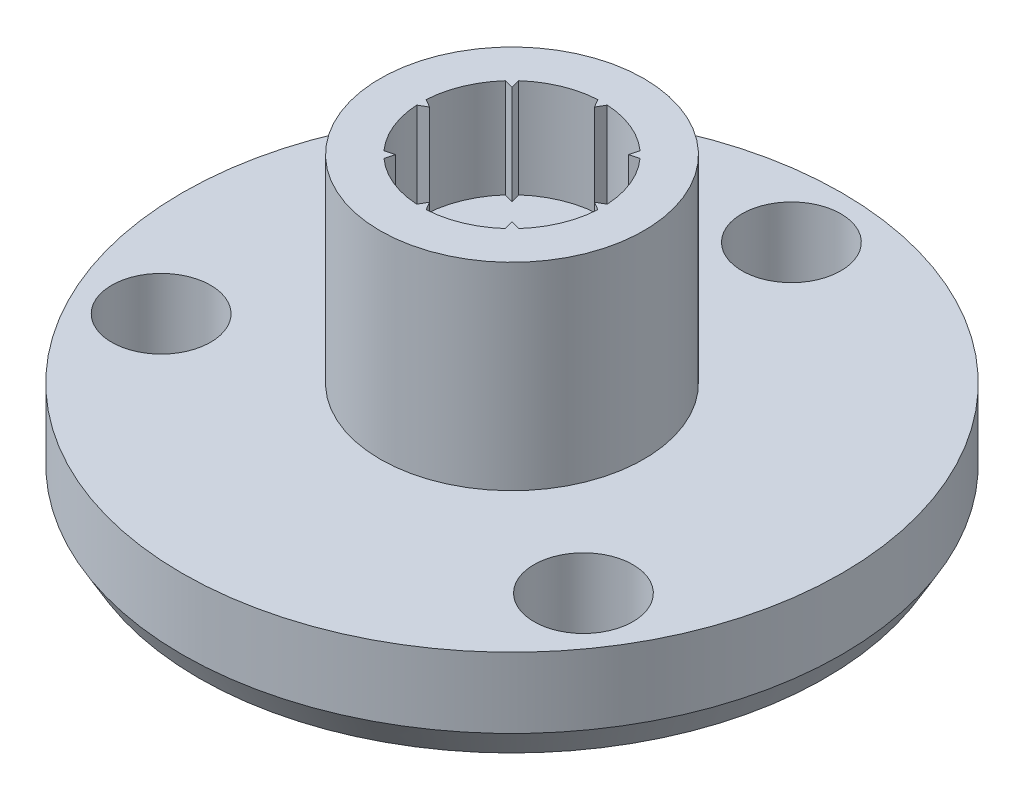
ISO-10303-21;
HEADER;
FILE_DESCRIPTION(('STEP AP214'),'2;1');
FILE_NAME('part.step','',(''),(''),'','','');
FILE_SCHEMA(('AUTOMOTIVE_DESIGN { 1 0 10303 214 1 1 1 1 }'));
ENDSEC;
DATA;
#1=APPLICATION_CONTEXT('core data for automotive mechanical design processes');
#2=APPLICATION_PROTOCOL_DEFINITION('international standard','automotive_design',2000,#1);
#3=PRODUCT_CONTEXT('',#1,'mechanical');
#4=PRODUCT('Part','Part','',(#3));
#5=PRODUCT_RELATED_PRODUCT_CATEGORY('part','',(#4));
#6=PRODUCT_DEFINITION_FORMATION('','',#4);
#7=PRODUCT_DEFINITION_CONTEXT('part definition',#1,'design');
#8=PRODUCT_DEFINITION('design','',#6,#7);
#9=PRODUCT_DEFINITION_SHAPE('','',#8);
#10=(LENGTH_UNIT() NAMED_UNIT(*) SI_UNIT(.MILLI.,.METRE.));
#11=(NAMED_UNIT(*) PLANE_ANGLE_UNIT() SI_UNIT($,.RADIAN.));
#12=(NAMED_UNIT(*) SI_UNIT($,.STERADIAN.) SOLID_ANGLE_UNIT());
#13=UNCERTAINTY_MEASURE_WITH_UNIT(LENGTH_MEASURE(1.E-05),#10,'distance_accuracy_value','');
#14=(GEOMETRIC_REPRESENTATION_CONTEXT(3) GLOBAL_UNCERTAINTY_ASSIGNED_CONTEXT((#13)) GLOBAL_UNIT_ASSIGNED_CONTEXT((#10,
#11,#12)) REPRESENTATION_CONTEXT('',''));
#15=CARTESIAN_POINT('',(0.,0.,0.));
#16=DIRECTION('',(0.,0.,1.));
#17=DIRECTION('',(1.,0.,0.));
#18=AXIS2_PLACEMENT_3D('',#15,#16,#17);
#19=CARTESIAN_POINT('',(0.,6.,0.));
#20=DIRECTION('',(0.,1.,0.));
#21=DIRECTION('',(0.,0.,1.));
#22=AXIS2_PLACEMENT_3D('',#19,#20,#21);
#23=CYLINDRICAL_SURFACE('',#22,2.75);
#24=DIRECTION('',(0.,1.,0.));
#25=VECTOR('',#24,1.);
#26=CARTESIAN_POINT('',(-2.04250159740627,6.,-1.84138187907692));
#27=LINE('',#26,#25);
#28=CARTESIAN_POINT('',(-2.04250159740627,9.,-1.84138187907692));
#29=VERTEX_POINT('',#28);
#30=CARTESIAN_POINT('',(-2.04250159740627,6.,-1.84138187907692));
#31=VERTEX_POINT('',#30);
#32=EDGE_CURVE('E218',#29,#31,#27,.F.);
#33=ORIENTED_EDGE('',*,*,#32,.F.);
#34=CARTESIAN_POINT('',(0.,9.,0.));
#35=DIRECTION('',(0.,1.,0.));
#36=DIRECTION('',(0.,0.,1.));
#37=AXIS2_PLACEMENT_3D('',#34,#35,#36);
#38=CIRCLE('',#37,2.75);
#39=CARTESIAN_POINT('',(-2.74632034355964,9.,-0.14221311666107));
#40=VERTEX_POINT('',#39);
#41=EDGE_CURVE('E204',#29,#40,#38,.T.);
#42=ORIENTED_EDGE('',*,*,#41,.T.);
#43=DIRECTION('',(0.,1.,0.));
#44=VECTOR('',#43,1.);
#45=CARTESIAN_POINT('',(-2.74632034355964,6.,-0.142213116661069));
#46=LINE('',#45,#44);
#47=CARTESIAN_POINT('',(-2.74632034355964,6.,-0.14221311666107));
#48=VERTEX_POINT('',#47);
#49=EDGE_CURVE('E233',#48,#40,#46,.T.);
#50=ORIENTED_EDGE('',*,*,#49,.F.);
#51=CARTESIAN_POINT('',(0.,6.,0.));
#52=DIRECTION('',(0.,1.,0.));
#53=DIRECTION('',(0.,0.,1.));
#54=AXIS2_PLACEMENT_3D('',#51,#52,#53);
#55=CIRCLE('',#54,2.75);
#56=EDGE_CURVE('E348',#31,#48,#55,.T.);
#57=ORIENTED_EDGE('',*,*,#56,.F.);
#58=EDGE_LOOP('',(#33,#42,#50,#57));
#59=FACE_BOUND('',#58,.T.);
#60=ADVANCED_FACE('F33',(#59),#23,.F.);
#61=DIRECTION('',(0.,1.,0.));
#62=VECTOR('',#61,1.);
#63=CARTESIAN_POINT('',(-1.84138187907687,6.,-2.04250159740631));
#64=LINE('',#63,#62);
#65=CARTESIAN_POINT('',(-1.84138187907687,6.,-2.04250159740631));
#66=VERTEX_POINT('',#65);
#67=CARTESIAN_POINT('',(-1.84138187907687,9.,-2.04250159740631));
#68=VERTEX_POINT('',#67);
#69=EDGE_CURVE('E211',#66,#68,#64,.T.);
#70=ORIENTED_EDGE('',*,*,#69,.F.);
#71=CARTESIAN_POINT('',(-0.142213116661041,6.,-2.74632034355964));
#72=VERTEX_POINT('',#71);
#73=EDGE_CURVE('E344',#72,#66,#55,.T.);
#74=ORIENTED_EDGE('',*,*,#73,.F.);
#75=DIRECTION('',(0.,1.,0.));
#76=VECTOR('',#75,1.);
#77=CARTESIAN_POINT('',(-0.142213116661041,6.,-2.74632034355964));
#78=LINE('',#77,#76);
#79=CARTESIAN_POINT('',(-0.142213116661041,9.,-2.74632034355964));
#80=VERTEX_POINT('',#79);
#81=EDGE_CURVE('E341',#80,#72,#78,.F.);
#82=ORIENTED_EDGE('',*,*,#81,.F.);
#83=EDGE_CURVE('E350',#80,#68,#38,.T.);
#84=ORIENTED_EDGE('',*,*,#83,.T.);
#85=EDGE_LOOP('',(#70,#74,#82,#84));
#86=FACE_BOUND('',#85,.T.);
#87=ADVANCED_FACE('F421',(#86),#23,.F.);
#88=CARTESIAN_POINT('',(0.,6.,0.));
#89=DIRECTION('',(0.,1.,0.));
#90=DIRECTION('',(0.,0.,1.));
#91=AXIS2_PLACEMENT_3D('',#88,#89,#90);
#92=PLANE('',#91);
#93=CARTESIAN_POINT('',(0.,6.,0.));
#94=DIRECTION('',(0.,1.,0.));
#95=DIRECTION('',(0.,0.,1.));
#96=AXIS2_PLACEMENT_3D('',#93,#94,#95);
#97=CIRCLE('',#96,0.925);
#98=CARTESIAN_POINT('',(0.,6.,0.925));
#99=VERTEX_POINT('',#98);
#100=EDGE_CURVE('E347',#99,#99,#97,.T.);
#101=ORIENTED_EDGE('',*,*,#100,.F.);
#102=EDGE_LOOP('',(#101));
#103=FACE_BOUND('',#102,.T.);
#104=DIRECTION('',(-0.25881904510251,0.,-0.965925826289071));
#105=VECTOR('',#104,1.);
#106=CARTESIAN_POINT('',(-1.76776695296635,6.,-1.76776695296639));
#107=LINE('',#106,#105);
#108=CARTESIAN_POINT('',(-1.76776695296635,6.,-1.76776695296639));
#109=VERTEX_POINT('',#108);
#110=EDGE_CURVE('E207',#109,#66,#107,.T.);
#111=ORIENTED_EDGE('',*,*,#110,.F.);
#112=DIRECTION('',(0.965925826289065,0.,0.258819045102532));
#113=VECTOR('',#112,1.);
#114=CARTESIAN_POINT('',(-2.18602510483525,6.,-1.8798388869874));
#115=LINE('',#114,#113);
#116=EDGE_CURVE('E215',#31,#109,#115,.T.);
#117=ORIENTED_EDGE('',*,*,#116,.F.);
#118=ORIENTED_EDGE('',*,*,#56,.T.);
#119=DIRECTION('',(-0.866025403784434,0.,-0.500000000000009));
#120=VECTOR('',#119,1.);
#121=CARTESIAN_POINT('',(-2.5,6.,0.));
#122=LINE('',#121,#120);
#123=CARTESIAN_POINT('',(-2.5,6.,0.));
#124=VERTEX_POINT('',#123);
#125=EDGE_CURVE('E228',#124,#48,#122,.T.);
#126=ORIENTED_EDGE('',*,*,#125,.F.);
#127=DIRECTION('',(0.866025403784443,0.,-0.499999999999992));
#128=VECTOR('',#127,1.);
#129=CARTESIAN_POINT('',(-2.875,6.,0.21650635094608));
#130=LINE('',#129,#128);
#131=CARTESIAN_POINT('',(-2.74632034355964,6.,0.142213116661013));
#132=VERTEX_POINT('',#131);
#133=EDGE_CURVE('E224',#132,#124,#130,.T.);
#134=ORIENTED_EDGE('',*,*,#133,.F.);
#135=CARTESIAN_POINT('',(-2.0425015974063,6.,1.84138187907688));
#136=VERTEX_POINT('',#135);
#137=EDGE_CURVE('E480',#132,#136,#55,.T.);
#138=ORIENTED_EDGE('',*,*,#137,.T.);
#139=DIRECTION('',(-0.965925826289071,0.,0.258819045102513));
#140=VECTOR('',#139,1.);
#141=CARTESIAN_POINT('',(-1.76776695296638,6.,1.76776695296635));
#142=LINE('',#141,#140);
#143=CARTESIAN_POINT('',(-1.76776695296638,6.,1.76776695296635));
#144=VERTEX_POINT('',#143);
#145=EDGE_CURVE('E242',#144,#136,#142,.T.);
#146=ORIENTED_EDGE('',*,*,#145,.F.);
#147=DIRECTION('',(0.258819045102528,0.,-0.965925826289066));
#148=VECTOR('',#147,1.);
#149=CARTESIAN_POINT('',(-1.87983888698739,6.,2.18602510483526));
#150=LINE('',#149,#148);
#151=CARTESIAN_POINT('',(-1.84138187907691,6.,2.04250159740627));
#152=VERTEX_POINT('',#151);
#153=EDGE_CURVE('E238',#152,#144,#150,.T.);
#154=ORIENTED_EDGE('',*,*,#153,.F.);
#155=CARTESIAN_POINT('',(-0.14221311666106,6.,2.74632034355964));
#156=VERTEX_POINT('',#155);
#157=EDGE_CURVE('E483',#152,#156,#55,.T.);
#158=ORIENTED_EDGE('',*,*,#157,.T.);
#159=DIRECTION('',(-0.500000000000005,0.,0.866025403784436));
#160=VECTOR('',#159,1.);
#161=CARTESIAN_POINT('',(0.,6.,2.5));
#162=LINE('',#161,#160);
#163=CARTESIAN_POINT('',(0.,6.,2.5));
#164=VERTEX_POINT('',#163);
#165=EDGE_CURVE('E260',#164,#156,#162,.T.);
#166=ORIENTED_EDGE('',*,*,#165,.F.);
#167=DIRECTION('',(-0.499999999999995,0.,-0.866025403784441));
#168=VECTOR('',#167,1.);
#169=CARTESIAN_POINT('',(0.21650635094609,6.,2.875));
#170=LINE('',#169,#168);
#171=CARTESIAN_POINT('',(0.142213116661022,6.,2.74632034355964));
#172=VERTEX_POINT('',#171);
#173=EDGE_CURVE('E256',#172,#164,#170,.T.);
#174=ORIENTED_EDGE('',*,*,#173,.F.);
#175=CARTESIAN_POINT('',(1.84138187907689,6.,2.0425015974063));
#176=VERTEX_POINT('',#175);
#177=EDGE_CURVE('E484',#172,#176,#55,.T.);
#178=ORIENTED_EDGE('',*,*,#177,.T.);
#179=DIRECTION('',(0.258819045102516,0.,0.96592582628907));
#180=VECTOR('',#179,1.);
#181=CARTESIAN_POINT('',(1.76776695296636,6.,1.76776695296638));
#182=LINE('',#181,#180);
#183=CARTESIAN_POINT('',(1.76776695296636,6.,1.76776695296638));
#184=VERTEX_POINT('',#183);
#185=EDGE_CURVE('E278',#184,#176,#182,.T.);
#186=ORIENTED_EDGE('',*,*,#185,.F.);
#187=DIRECTION('',(-0.965925826289067,0.,-0.258819045102525));
#188=VECTOR('',#187,1.);
#189=CARTESIAN_POINT('',(2.18602510483526,6.,1.87983888698739));
#190=LINE('',#189,#188);
#191=CARTESIAN_POINT('',(2.04250159740628,6.,1.84138187907691));
#192=VERTEX_POINT('',#191);
#193=EDGE_CURVE('E274',#192,#184,#190,.T.);
#194=ORIENTED_EDGE('',*,*,#193,.F.);
#195=CARTESIAN_POINT('',(2.74632034355964,6.,0.14221311666105));
#196=VERTEX_POINT('',#195);
#197=EDGE_CURVE('E488',#192,#196,#55,.T.);
#198=ORIENTED_EDGE('',*,*,#197,.T.);
#199=DIRECTION('',(0.866025403784437,0.,0.500000000000003));
#200=VECTOR('',#199,1.);
#201=CARTESIAN_POINT('',(2.5,6.,0.));
#202=LINE('',#201,#200);
#203=CARTESIAN_POINT('',(2.5,6.,0.));
#204=VERTEX_POINT('',#203);
#205=EDGE_CURVE('E296',#204,#196,#202,.T.);
#206=ORIENTED_EDGE('',*,*,#205,.F.);
#207=DIRECTION('',(-0.86602540378444,0.,0.499999999999998));
#208=VECTOR('',#207,1.);
#209=CARTESIAN_POINT('',(2.875,6.,-0.2165063509461));
#210=LINE('',#209,#208);
#211=CARTESIAN_POINT('',(2.74632034355964,6.,-0.142213116661032));
#212=VERTEX_POINT('',#211);
#213=EDGE_CURVE('E292',#212,#204,#210,.T.);
#214=ORIENTED_EDGE('',*,*,#213,.F.);
#215=CARTESIAN_POINT('',(2.04250159740629,6.,-1.84138187907689));
#216=VERTEX_POINT('',#215);
#217=EDGE_CURVE('E492',#212,#216,#55,.T.);
#218=ORIENTED_EDGE('',*,*,#217,.T.);
#219=DIRECTION('',(0.965925826289069,0.,-0.258819045102519));
#220=VECTOR('',#219,1.);
#221=CARTESIAN_POINT('',(1.76776695296637,6.,-1.76776695296637));
#222=LINE('',#221,#220);
#223=CARTESIAN_POINT('',(1.76776695296637,6.,-1.76776695296637));
#224=VERTEX_POINT('',#223);
#225=EDGE_CURVE('E314',#224,#216,#222,.T.);
#226=ORIENTED_EDGE('',*,*,#225,.F.);
#227=DIRECTION('',(-0.258819045102521,0.,0.965925826289068));
#228=VECTOR('',#227,1.);
#229=CARTESIAN_POINT('',(1.87983888698738,6.,-2.18602510483527));
#230=LINE('',#229,#228);
#231=CARTESIAN_POINT('',(1.8413818790769,6.,-2.04250159740628));
#232=VERTEX_POINT('',#231);
#233=EDGE_CURVE('E310',#232,#224,#230,.T.);
#234=ORIENTED_EDGE('',*,*,#233,.F.);
#235=CARTESIAN_POINT('',(0.142213116661041,6.,-2.74632034355964));
#236=VERTEX_POINT('',#235);
#237=EDGE_CURVE('E349',#232,#236,#55,.T.);
#238=ORIENTED_EDGE('',*,*,#237,.T.);
#239=DIRECTION('',(0.499999999999999,0.,-0.866025403784439));
#240=VECTOR('',#239,1.);
#241=CARTESIAN_POINT('',(0.,6.,-2.5));
#242=LINE('',#241,#240);
#243=CARTESIAN_POINT('',(0.,6.,-2.5));
#244=VERTEX_POINT('',#243);
#245=EDGE_CURVE('E328',#244,#236,#242,.T.);
#246=ORIENTED_EDGE('',*,*,#245,.F.);
#247=DIRECTION('',(-0.500000000000001,0.,-0.866025403784438));
#248=VECTOR('',#247,1.);
#249=CARTESIAN_POINT('',(1.08253175473055,6.,-0.625000000000002));
#250=LINE('',#249,#248);
#251=EDGE_CURVE('E11',#244,#72,#250,.T.);
#252=ORIENTED_EDGE('',*,*,#251,.T.);
#253=ORIENTED_EDGE('',*,*,#73,.T.);
#254=EDGE_LOOP('',(#111,#117,#118,#126,#134,#138,#146,#154,#158,#166,#174,#178,#186,#194,#198,
#206,#214,#218,#226,#234,#238,#246,#252,#253));
#255=FACE_BOUND('',#254,.T.);
#256=ADVANCED_FACE('F427',(#103,#255),#92,.T.);
#257=DIRECTION('',(0.,1.,0.));
#258=VECTOR('',#257,1.);
#259=CARTESIAN_POINT('',(-2.74632034355964,6.,0.142213116661012));
#260=LINE('',#259,#258);
#261=CARTESIAN_POINT('',(-2.74632034355964,9.,0.142213116661013));
#262=VERTEX_POINT('',#261);
#263=EDGE_CURVE('E236',#262,#132,#260,.F.);
#264=ORIENTED_EDGE('',*,*,#263,.F.);
#265=CARTESIAN_POINT('',(-2.0425015974063,9.,1.84138187907688));
#266=VERTEX_POINT('',#265);
#267=EDGE_CURVE('E463',#262,#266,#38,.T.);
#268=ORIENTED_EDGE('',*,*,#267,.T.);
#269=DIRECTION('',(0.,1.,0.));
#270=VECTOR('',#269,1.);
#271=CARTESIAN_POINT('',(-2.0425015974063,6.,1.84138187907688));
#272=LINE('',#271,#270);
#273=EDGE_CURVE('E251',#136,#266,#272,.T.);
#274=ORIENTED_EDGE('',*,*,#273,.F.);
#275=ORIENTED_EDGE('',*,*,#137,.F.);
#276=EDGE_LOOP('',(#264,#268,#274,#275));
#277=FACE_BOUND('',#276,.T.);
#278=ADVANCED_FACE('F429',(#277),#23,.F.);
#279=DIRECTION('',(0.,1.,0.));
#280=VECTOR('',#279,1.);
#281=CARTESIAN_POINT('',(-1.84138187907691,6.,2.04250159740627));
#282=LINE('',#281,#280);
#283=CARTESIAN_POINT('',(-1.84138187907691,9.,2.04250159740627));
#284=VERTEX_POINT('',#283);
#285=EDGE_CURVE('E254',#284,#152,#282,.F.);
#286=ORIENTED_EDGE('',*,*,#285,.F.);
#287=CARTESIAN_POINT('',(-0.14221311666106,9.,2.74632034355964));
#288=VERTEX_POINT('',#287);
#289=EDGE_CURVE('E458',#284,#288,#38,.T.);
#290=ORIENTED_EDGE('',*,*,#289,.T.);
#291=DIRECTION('',(0.,1.,0.));
#292=VECTOR('',#291,1.);
#293=CARTESIAN_POINT('',(-0.14221311666106,6.,2.74632034355964));
#294=LINE('',#293,#292);
#295=EDGE_CURVE('E269',#156,#288,#294,.T.);
#296=ORIENTED_EDGE('',*,*,#295,.F.);
#297=ORIENTED_EDGE('',*,*,#157,.F.);
#298=EDGE_LOOP('',(#286,#290,#296,#297));
#299=FACE_BOUND('',#298,.T.);
#300=ADVANCED_FACE('F522',(#299),#23,.F.);
#301=DIRECTION('',(0.,1.,0.));
#302=VECTOR('',#301,1.);
#303=CARTESIAN_POINT('',(0.142213116661022,6.,2.74632034355964));
#304=LINE('',#303,#302);
#305=CARTESIAN_POINT('',(0.142213116661022,9.,2.74632034355964));
#306=VERTEX_POINT('',#305);
#307=EDGE_CURVE('E272',#306,#172,#304,.F.);
#308=ORIENTED_EDGE('',*,*,#307,.F.);
#309=CARTESIAN_POINT('',(1.84138187907689,9.,2.0425015974063));
#310=VERTEX_POINT('',#309);
#311=EDGE_CURVE('E453',#306,#310,#38,.T.);
#312=ORIENTED_EDGE('',*,*,#311,.T.);
#313=DIRECTION('',(0.,1.,0.));
#314=VECTOR('',#313,1.);
#315=CARTESIAN_POINT('',(1.84138187907689,6.,2.0425015974063));
#316=LINE('',#315,#314);
#317=EDGE_CURVE('E287',#176,#310,#316,.T.);
#318=ORIENTED_EDGE('',*,*,#317,.F.);
#319=ORIENTED_EDGE('',*,*,#177,.F.);
#320=EDGE_LOOP('',(#308,#312,#318,#319));
#321=FACE_BOUND('',#320,.T.);
#322=ADVANCED_FACE('F627',(#321),#23,.F.);
#323=DIRECTION('',(0.,1.,0.));
#324=VECTOR('',#323,1.);
#325=CARTESIAN_POINT('',(2.04250159740628,6.,1.84138187907691));
#326=LINE('',#325,#324);
#327=CARTESIAN_POINT('',(2.04250159740628,9.,1.84138187907691));
#328=VERTEX_POINT('',#327);
#329=EDGE_CURVE('E290',#328,#192,#326,.F.);
#330=ORIENTED_EDGE('',*,*,#329,.F.);
#331=CARTESIAN_POINT('',(2.74632034355964,9.,0.14221311666105));
#332=VERTEX_POINT('',#331);
#333=EDGE_CURVE('E449',#328,#332,#38,.T.);
#334=ORIENTED_EDGE('',*,*,#333,.T.);
#335=DIRECTION('',(0.,1.,0.));
#336=VECTOR('',#335,1.);
#337=CARTESIAN_POINT('',(2.74632034355964,6.,0.142213116661051));
#338=LINE('',#337,#336);
#339=EDGE_CURVE('E305',#196,#332,#338,.T.);
#340=ORIENTED_EDGE('',*,*,#339,.F.);
#341=ORIENTED_EDGE('',*,*,#197,.F.);
#342=EDGE_LOOP('',(#330,#334,#340,#341));
#343=FACE_BOUND('',#342,.T.);
#344=ADVANCED_FACE('F438',(#343),#23,.F.);
#345=DIRECTION('',(0.,1.,0.));
#346=VECTOR('',#345,1.);
#347=CARTESIAN_POINT('',(2.74632034355964,6.,-0.142213116661032));
#348=LINE('',#347,#346);
#349=CARTESIAN_POINT('',(2.74632034355964,9.,-0.142213116661032));
#350=VERTEX_POINT('',#349);
#351=EDGE_CURVE('E308',#350,#212,#348,.F.);
#352=ORIENTED_EDGE('',*,*,#351,.F.);
#353=CARTESIAN_POINT('',(2.04250159740629,9.,-1.84138187907689));
#354=VERTEX_POINT('',#353);
#355=EDGE_CURVE('E448',#350,#354,#38,.T.);
#356=ORIENTED_EDGE('',*,*,#355,.T.);
#357=DIRECTION('',(0.,1.,0.));
#358=VECTOR('',#357,1.);
#359=CARTESIAN_POINT('',(2.04250159740629,6.,-1.84138187907689));
#360=LINE('',#359,#358);
#361=EDGE_CURVE('E323',#216,#354,#360,.T.);
#362=ORIENTED_EDGE('',*,*,#361,.F.);
#363=ORIENTED_EDGE('',*,*,#217,.F.);
#364=EDGE_LOOP('',(#352,#356,#362,#363));
#365=FACE_BOUND('',#364,.T.);
#366=ADVANCED_FACE('F433',(#365),#23,.F.);
#367=DIRECTION('',(0.,1.,0.));
#368=VECTOR('',#367,1.);
#369=CARTESIAN_POINT('',(1.8413818790769,6.,-2.04250159740628));
#370=LINE('',#369,#368);
#371=CARTESIAN_POINT('',(1.8413818790769,9.,-2.04250159740628));
#372=VERTEX_POINT('',#371);
#373=EDGE_CURVE('E326',#372,#232,#370,.F.);
#374=ORIENTED_EDGE('',*,*,#373,.F.);
#375=CARTESIAN_POINT('',(0.14221311666104,9.,-2.74632034355964));
#376=VERTEX_POINT('',#375);
#377=EDGE_CURVE('E343',#372,#376,#38,.T.);
#378=ORIENTED_EDGE('',*,*,#377,.T.);
#379=DIRECTION('',(0.,1.,0.));
#380=VECTOR('',#379,1.);
#381=CARTESIAN_POINT('',(0.142213116661041,6.,-2.74632034355964));
#382=LINE('',#381,#380);
#383=EDGE_CURVE('E338',#236,#376,#382,.T.);
#384=ORIENTED_EDGE('',*,*,#383,.F.);
#385=ORIENTED_EDGE('',*,*,#237,.F.);
#386=EDGE_LOOP('',(#374,#378,#384,#385));
#387=FACE_BOUND('',#386,.T.);
#388=ADVANCED_FACE('F407',(#387),#23,.F.);
#389=CARTESIAN_POINT('',(0.,3.,0.));
#390=DIRECTION('',(0.,-1.,0.));
#391=DIRECTION('',(0.,0.,-1.));
#392=AXIS2_PLACEMENT_3D('',#389,#390,#391);
#393=CYLINDRICAL_SURFACE('',#392,10.);
#394=CARTESIAN_POINT('',(0.,0.866025403784436,0.));
#395=DIRECTION('',(0.,1.,0.));
#396=DIRECTION('',(0.,0.,1.));
#397=AXIS2_PLACEMENT_3D('',#394,#395,#396);
#398=CIRCLE('',#397,10.);
#399=CARTESIAN_POINT('',(0.,0.866025403784436,10.));
#400=VERTEX_POINT('',#399);
#401=EDGE_CURVE('E388',#400,#400,#398,.T.);
#402=ORIENTED_EDGE('',*,*,#401,.T.);
#403=EDGE_LOOP('',(#402));
#404=FACE_BOUND('',#403,.T.);
#405=CARTESIAN_POINT('',(0.,3.,0.));
#406=DIRECTION('',(0.,1.,0.));
#407=DIRECTION('',(0.,0.,1.));
#408=AXIS2_PLACEMENT_3D('',#405,#406,#407);
#409=CIRCLE('',#408,10.);
#410=CARTESIAN_POINT('',(0.,3.,10.));
#411=VERTEX_POINT('',#410);
#412=EDGE_CURVE('E382',#411,#411,#409,.T.);
#413=ORIENTED_EDGE('',*,*,#412,.F.);
#414=EDGE_LOOP('',(#413));
#415=FACE_BOUND('',#414,.T.);
#416=ADVANCED_FACE('F403',(#404,#415),#393,.T.);
#417=CARTESIAN_POINT('',(0.,3.,0.));
#418=DIRECTION('',(0.,1.,0.));
#419=DIRECTION('',(0.,0.,1.));
#420=AXIS2_PLACEMENT_3D('',#417,#418,#419);
#421=PLANE('',#420);
#422=CARTESIAN_POINT('',(-7.14173856444116,3.,3.5));
#423=DIRECTION('',(0.,-1.,0.));
#424=DIRECTION('',(0.,0.,-1.));
#425=AXIS2_PLACEMENT_3D('',#422,#423,#424);
#426=CIRCLE('',#425,1.5);
#427=CARTESIAN_POINT('',(-7.14173856444116,3.,2.));
#428=VERTEX_POINT('',#427);
#429=EDGE_CURVE('E361',#428,#428,#426,.T.);
#430=ORIENTED_EDGE('',*,*,#429,.T.);
#431=EDGE_LOOP('',(#430));
#432=FACE_BOUND('',#431,.T.);
#433=CARTESIAN_POINT('',(6.6019581954661,3.,4.43492702399325));
#434=DIRECTION('',(0.,-1.,0.));
#435=DIRECTION('',(0.,0.,-1.));
#436=AXIS2_PLACEMENT_3D('',#433,#434,#435);
#437=CIRCLE('',#436,1.50000000000021);
#438=CARTESIAN_POINT('',(6.6019581954661,3.,2.93492702399304));
#439=VERTEX_POINT('',#438);
#440=EDGE_CURVE('E368',#439,#439,#437,.T.);
#441=ORIENTED_EDGE('',*,*,#440,.T.);
#442=EDGE_LOOP('',(#441));
#443=FACE_BOUND('',#442,.T.);
#444=CARTESIAN_POINT('',(0.539780368975215,3.,-7.93492702399295));
#445=DIRECTION('',(0.,-1.,0.));
#446=DIRECTION('',(0.,0.,-1.));
#447=AXIS2_PLACEMENT_3D('',#444,#445,#446);
#448=CIRCLE('',#447,1.5000000000001);
#449=CARTESIAN_POINT('',(0.539780368975215,3.,-9.43492702399305));
#450=VERTEX_POINT('',#449);
#451=EDGE_CURVE('E374',#450,#450,#448,.T.);
#452=ORIENTED_EDGE('',*,*,#451,.T.);
#453=EDGE_LOOP('',(#452));
#454=FACE_BOUND('',#453,.T.);
#455=CARTESIAN_POINT('',(0.,3.,0.));
#456=DIRECTION('',(0.,1.,0.));
#457=DIRECTION('',(0.,0.,1.));
#458=AXIS2_PLACEMENT_3D('',#455,#456,#457);
#459=CIRCLE('',#458,4.);
#460=CARTESIAN_POINT('',(0.,3.,4.));
#461=VERTEX_POINT('',#460);
#462=EDGE_CURVE('E385',#461,#461,#459,.T.);
#463=ORIENTED_EDGE('',*,*,#462,.F.);
#464=EDGE_LOOP('',(#463));
#465=FACE_BOUND('',#464,.T.);
#466=ORIENTED_EDGE('',*,*,#412,.T.);
#467=EDGE_LOOP('',(#466));
#468=FACE_BOUND('',#467,.T.);
#469=ADVANCED_FACE('F406',(#432,#443,#454,#465,#468),#421,.T.);
#470=CARTESIAN_POINT('',(0.,0.,0.));
#471=DIRECTION('',(0.,1.,0.));
#472=DIRECTION('',(0.,0.,1.));
#473=AXIS2_PLACEMENT_3D('',#470,#471,#472);
#474=PLANE('',#473);
#475=CARTESIAN_POINT('',(0.,0.,0.));
#476=DIRECTION('',(0.,1.,0.));
#477=DIRECTION('',(0.,0.,1.));
#478=AXIS2_PLACEMENT_3D('',#475,#476,#477);
#479=CIRCLE('',#478,9.5);
#480=CARTESIAN_POINT('',(0.,0.,9.5));
#481=VERTEX_POINT('',#480);
#482=EDGE_CURVE('E41',#481,#481,#479,.F.);
#483=ORIENTED_EDGE('',*,*,#482,.T.);
#484=EDGE_LOOP('',(#483));
#485=FACE_BOUND('',#484,.T.);
#486=CARTESIAN_POINT('',(-7.14173856444116,0.,3.5));
#487=DIRECTION('',(0.,-1.,0.));
#488=DIRECTION('',(0.,0.,-1.));
#489=AXIS2_PLACEMENT_3D('',#486,#487,#488);
#490=CIRCLE('',#489,1.5);
#491=CARTESIAN_POINT('',(-7.14173856444116,0.,2.));
#492=VERTEX_POINT('',#491);
#493=EDGE_CURVE('E365',#492,#492,#490,.T.);
#494=ORIENTED_EDGE('',*,*,#493,.F.);
#495=EDGE_LOOP('',(#494));
#496=FACE_BOUND('',#495,.T.);
#497=CARTESIAN_POINT('',(6.6019581954661,0.,4.43492702399325));
#498=DIRECTION('',(0.,-1.,0.));
#499=DIRECTION('',(0.,0.,-1.));
#500=AXIS2_PLACEMENT_3D('',#497,#498,#499);
#501=CIRCLE('',#500,1.50000000000021);
#502=CARTESIAN_POINT('',(6.6019581954661,0.,2.93492702399304));
#503=VERTEX_POINT('',#502);
#504=EDGE_CURVE('E371',#503,#503,#501,.T.);
#505=ORIENTED_EDGE('',*,*,#504,.F.);
#506=EDGE_LOOP('',(#505));
#507=FACE_BOUND('',#506,.T.);
#508=CARTESIAN_POINT('',(0.539780368975215,0.,-7.93492702399295));
#509=DIRECTION('',(0.,-1.,0.));
#510=DIRECTION('',(0.,0.,-1.));
#511=AXIS2_PLACEMENT_3D('',#508,#509,#510);
#512=CIRCLE('',#511,1.5000000000001);
#513=CARTESIAN_POINT('',(0.539780368975215,0.,-9.43492702399305));
#514=VERTEX_POINT('',#513);
#515=EDGE_CURVE('E358',#514,#514,#512,.T.);
#516=ORIENTED_EDGE('',*,*,#515,.F.);
#517=EDGE_LOOP('',(#516));
#518=FACE_BOUND('',#517,.T.);
#519=CARTESIAN_POINT('',(0.,0.,0.));
#520=DIRECTION('',(0.,-1.,0.));
#521=DIRECTION('',(0.,0.,-1.));
#522=AXIS2_PLACEMENT_3D('',#519,#520,#521);
#523=CIRCLE('',#522,2.5);
#524=CARTESIAN_POINT('',(0.,0.,-2.5));
#525=VERTEX_POINT('',#524);
#526=EDGE_CURVE('E364',#525,#525,#523,.T.);
#527=ORIENTED_EDGE('',*,*,#526,.F.);
#528=EDGE_LOOP('',(#527));
#529=FACE_BOUND('',#528,.T.);
#530=ADVANCED_FACE('F395',(#485,#496,#507,#518,#529),#474,.F.);
#531=CARTESIAN_POINT('',(0.,6.,0.));
#532=DIRECTION('',(0.,-1.,0.));
#533=DIRECTION('',(0.,0.,-1.));
#534=AXIS2_PLACEMENT_3D('',#531,#532,#533);
#535=CYLINDRICAL_SURFACE('',#534,4.);
#536=ORIENTED_EDGE('',*,*,#462,.T.);
#537=EDGE_LOOP('',(#536));
#538=FACE_BOUND('',#537,.T.);
#539=CARTESIAN_POINT('',(0.,9.,0.));
#540=DIRECTION('',(0.,1.,0.));
#541=DIRECTION('',(0.,0.,1.));
#542=AXIS2_PLACEMENT_3D('',#539,#540,#541);
#543=CIRCLE('',#542,4.);
#544=CARTESIAN_POINT('',(0.,9.,4.));
#545=VERTEX_POINT('',#544);
#546=EDGE_CURVE('E352',#545,#545,#543,.T.);
#547=ORIENTED_EDGE('',*,*,#546,.F.);
#548=EDGE_LOOP('',(#547));
#549=FACE_BOUND('',#548,.T.);
#550=ADVANCED_FACE('F416',(#538,#549),#535,.T.);
#551=CARTESIAN_POINT('',(0.,5.,0.));
#552=DIRECTION('',(0.,-1.,0.));
#553=DIRECTION('',(0.,0.,-1.));
#554=AXIS2_PLACEMENT_3D('',#551,#552,#553);
#555=CYLINDRICAL_SURFACE('',#554,2.5);
#556=CARTESIAN_POINT('',(0.,5.,0.));
#557=DIRECTION('',(0.,-1.,0.));
#558=DIRECTION('',(0.,0.,-1.));
#559=AXIS2_PLACEMENT_3D('',#556,#557,#558);
#560=CIRCLE('',#559,2.5);
#561=CARTESIAN_POINT('',(0.,5.,-2.5));
#562=VERTEX_POINT('',#561);
#563=EDGE_CURVE('E379',#562,#562,#560,.T.);
#564=ORIENTED_EDGE('',*,*,#563,.F.);
#565=EDGE_LOOP('',(#564));
#566=FACE_BOUND('',#565,.T.);
#567=ORIENTED_EDGE('',*,*,#526,.T.);
#568=EDGE_LOOP('',(#567));
#569=FACE_BOUND('',#568,.T.);
#570=ADVANCED_FACE('F547',(#566,#569),#555,.F.);
#571=CARTESIAN_POINT('',(0.,5.,0.));
#572=DIRECTION('',(0.,-1.,0.));
#573=DIRECTION('',(0.,0.,-1.));
#574=AXIS2_PLACEMENT_3D('',#571,#572,#573);
#575=PLANE('',#574);
#576=CARTESIAN_POINT('',(0.,5.,0.));
#577=DIRECTION('',(0.,1.,0.));
#578=DIRECTION('',(0.,0.,1.));
#579=AXIS2_PLACEMENT_3D('',#576,#577,#578);
#580=CIRCLE('',#579,0.925);
#581=CARTESIAN_POINT('',(0.,5.,0.925));
#582=VERTEX_POINT('',#581);
#583=EDGE_CURVE('E355',#582,#582,#580,.T.);
#584=ORIENTED_EDGE('',*,*,#583,.T.);
#585=EDGE_LOOP('',(#584));
#586=FACE_BOUND('',#585,.T.);
#587=ORIENTED_EDGE('',*,*,#563,.T.);
#588=EDGE_LOOP('',(#587));
#589=FACE_BOUND('',#588,.T.);
#590=ADVANCED_FACE('F543',(#586,#589),#575,.T.);
#591=CARTESIAN_POINT('',(0.539780368975215,3.,-7.93492702399295));
#592=DIRECTION('',(0.,-1.,0.));
#593=DIRECTION('',(0.,0.,-1.));
#594=AXIS2_PLACEMENT_3D('',#591,#592,#593);
#595=CYLINDRICAL_SURFACE('',#594,1.5000000000001);
#596=ORIENTED_EDGE('',*,*,#451,.F.);
#597=EDGE_LOOP('',(#596));
#598=FACE_BOUND('',#597,.T.);
#599=ORIENTED_EDGE('',*,*,#515,.T.);
#600=EDGE_LOOP('',(#599));
#601=FACE_BOUND('',#600,.T.);
#602=ADVANCED_FACE('F539',(#598,#601),#595,.F.);
#603=CARTESIAN_POINT('',(6.6019581954661,3.,4.43492702399325));
#604=DIRECTION('',(0.,-1.,0.));
#605=DIRECTION('',(0.,0.,-1.));
#606=AXIS2_PLACEMENT_3D('',#603,#604,#605);
#607=CYLINDRICAL_SURFACE('',#606,1.50000000000021);
#608=ORIENTED_EDGE('',*,*,#440,.F.);
#609=EDGE_LOOP('',(#608));
#610=FACE_BOUND('',#609,.T.);
#611=ORIENTED_EDGE('',*,*,#504,.T.);
#612=EDGE_LOOP('',(#611));
#613=FACE_BOUND('',#612,.T.);
#614=ADVANCED_FACE('F532',(#610,#613),#607,.F.);
#615=CARTESIAN_POINT('',(-7.14173856444116,3.,3.5));
#616=DIRECTION('',(0.,-1.,0.));
#617=DIRECTION('',(0.,0.,-1.));
#618=AXIS2_PLACEMENT_3D('',#615,#616,#617);
#619=CYLINDRICAL_SURFACE('',#618,1.5);
#620=ORIENTED_EDGE('',*,*,#429,.F.);
#621=EDGE_LOOP('',(#620));
#622=FACE_BOUND('',#621,.T.);
#623=ORIENTED_EDGE('',*,*,#493,.T.);
#624=EDGE_LOOP('',(#623));
#625=FACE_BOUND('',#624,.T.);
#626=ADVANCED_FACE('F526',(#622,#625),#619,.F.);
#627=CARTESIAN_POINT('',(0.,5.,0.));
#628=DIRECTION('',(0.,1.,0.));
#629=DIRECTION('',(0.,0.,1.));
#630=AXIS2_PLACEMENT_3D('',#627,#628,#629);
#631=CYLINDRICAL_SURFACE('',#630,0.925);
#632=ORIENTED_EDGE('',*,*,#583,.F.);
#633=EDGE_LOOP('',(#632));
#634=FACE_BOUND('',#633,.T.);
#635=ORIENTED_EDGE('',*,*,#100,.T.);
#636=EDGE_LOOP('',(#635));
#637=FACE_BOUND('',#636,.T.);
#638=ADVANCED_FACE('F400',(#634,#637),#631,.F.);
#639=CARTESIAN_POINT('',(0.,0.866025403784436,0.));
#640=DIRECTION('',(0.,1.,0.));
#641=DIRECTION('',(0.,0.,1.));
#642=AXIS2_PLACEMENT_3D('',#639,#640,#641);
#643=CONICAL_SURFACE('',#642,10.,0.523598775598299);
#644=ORIENTED_EDGE('',*,*,#482,.F.);
#645=EDGE_LOOP('',(#644));
#646=FACE_BOUND('',#645,.T.);
#647=ORIENTED_EDGE('',*,*,#401,.F.);
#648=EDGE_LOOP('',(#647));
#649=FACE_BOUND('',#648,.T.);
#650=ADVANCED_FACE('F35',(#646,#649),#643,.T.);
#651=CARTESIAN_POINT('',(0.,9.,0.));
#652=DIRECTION('',(0.,1.,0.));
#653=DIRECTION('',(0.,0.,1.));
#654=AXIS2_PLACEMENT_3D('',#651,#652,#653);
#655=PLANE('',#654);
#656=ORIENTED_EDGE('',*,*,#41,.F.);
#657=DIRECTION('',(0.965925826289065,0.,0.258819045102532));
#658=VECTOR('',#657,1.);
#659=CARTESIAN_POINT('',(-2.18602510483525,9.,-1.8798388869874));
#660=LINE('',#659,#658);
#661=CARTESIAN_POINT('',(-1.76776695296635,9.,-1.76776695296639));
#662=VERTEX_POINT('',#661);
#663=EDGE_CURVE('E197',#29,#662,#660,.T.);
#664=ORIENTED_EDGE('',*,*,#663,.T.);
#665=DIRECTION('',(-0.25881904510251,0.,-0.965925826289071));
#666=VECTOR('',#665,1.);
#667=CARTESIAN_POINT('',(-1.76776695296635,9.,-1.76776695296639));
#668=LINE('',#667,#666);
#669=EDGE_CURVE('E201',#662,#68,#668,.T.);
#670=ORIENTED_EDGE('',*,*,#669,.T.);
#671=ORIENTED_EDGE('',*,*,#83,.F.);
#672=DIRECTION('',(0.500000000000001,0.,0.866025403784438));
#673=VECTOR('',#672,1.);
#674=CARTESIAN_POINT('',(-0.21650635094611,9.,-2.875));
#675=LINE('',#674,#673);
#676=CARTESIAN_POINT('',(0.,9.,-2.5));
#677=VERTEX_POINT('',#676);
#678=EDGE_CURVE('E329',#80,#677,#675,.T.);
#679=ORIENTED_EDGE('',*,*,#678,.T.);
#680=DIRECTION('',(0.499999999999999,0.,-0.866025403784439));
#681=VECTOR('',#680,1.);
#682=CARTESIAN_POINT('',(0.,9.,-2.5));
#683=LINE('',#682,#681);
#684=EDGE_CURVE('E331',#677,#376,#683,.T.);
#685=ORIENTED_EDGE('',*,*,#684,.T.);
#686=ORIENTED_EDGE('',*,*,#377,.F.);
#687=DIRECTION('',(-0.258819045102521,0.,0.965925826289068));
#688=VECTOR('',#687,1.);
#689=CARTESIAN_POINT('',(1.87983888698738,9.,-2.18602510483527));
#690=LINE('',#689,#688);
#691=CARTESIAN_POINT('',(1.76776695296637,9.,-1.76776695296637));
#692=VERTEX_POINT('',#691);
#693=EDGE_CURVE('E311',#372,#692,#690,.T.);
#694=ORIENTED_EDGE('',*,*,#693,.T.);
#695=DIRECTION('',(0.965925826289069,0.,-0.258819045102519));
#696=VECTOR('',#695,1.);
#697=CARTESIAN_POINT('',(1.76776695296637,9.,-1.76776695296637));
#698=LINE('',#697,#696);
#699=EDGE_CURVE('E313',#692,#354,#698,.T.);
#700=ORIENTED_EDGE('',*,*,#699,.T.);
#701=ORIENTED_EDGE('',*,*,#355,.F.);
#702=DIRECTION('',(-0.86602540378444,0.,0.499999999999998));
#703=VECTOR('',#702,1.);
#704=CARTESIAN_POINT('',(2.875,9.,-0.2165063509461));
#705=LINE('',#704,#703);
#706=CARTESIAN_POINT('',(2.5,9.,0.));
#707=VERTEX_POINT('',#706);
#708=EDGE_CURVE('E293',#350,#707,#705,.T.);
#709=ORIENTED_EDGE('',*,*,#708,.T.);
#710=DIRECTION('',(0.866025403784437,0.,0.500000000000003));
#711=VECTOR('',#710,1.);
#712=CARTESIAN_POINT('',(2.5,9.,0.));
#713=LINE('',#712,#711);
#714=EDGE_CURVE('E295',#707,#332,#713,.T.);
#715=ORIENTED_EDGE('',*,*,#714,.T.);
#716=ORIENTED_EDGE('',*,*,#333,.F.);
#717=DIRECTION('',(-0.965925826289067,0.,-0.258819045102525));
#718=VECTOR('',#717,1.);
#719=CARTESIAN_POINT('',(2.18602510483526,9.,1.87983888698739));
#720=LINE('',#719,#718);
#721=CARTESIAN_POINT('',(1.76776695296636,9.,1.76776695296638));
#722=VERTEX_POINT('',#721);
#723=EDGE_CURVE('E275',#328,#722,#720,.T.);
#724=ORIENTED_EDGE('',*,*,#723,.T.);
#725=DIRECTION('',(0.258819045102516,0.,0.96592582628907));
#726=VECTOR('',#725,1.);
#727=CARTESIAN_POINT('',(1.76776695296636,9.,1.76776695296638));
#728=LINE('',#727,#726);
#729=EDGE_CURVE('E277',#722,#310,#728,.T.);
#730=ORIENTED_EDGE('',*,*,#729,.T.);
#731=ORIENTED_EDGE('',*,*,#311,.F.);
#732=DIRECTION('',(-0.499999999999995,0.,-0.866025403784441));
#733=VECTOR('',#732,1.);
#734=CARTESIAN_POINT('',(0.21650635094609,9.,2.875));
#735=LINE('',#734,#733);
#736=CARTESIAN_POINT('',(0.,9.,2.5));
#737=VERTEX_POINT('',#736);
#738=EDGE_CURVE('E257',#306,#737,#735,.T.);
#739=ORIENTED_EDGE('',*,*,#738,.T.);
#740=DIRECTION('',(-0.500000000000005,0.,0.866025403784436));
#741=VECTOR('',#740,1.);
#742=CARTESIAN_POINT('',(0.,9.,2.5));
#743=LINE('',#742,#741);
#744=EDGE_CURVE('E259',#737,#288,#743,.T.);
#745=ORIENTED_EDGE('',*,*,#744,.T.);
#746=ORIENTED_EDGE('',*,*,#289,.F.);
#747=DIRECTION('',(0.258819045102528,0.,-0.965925826289066));
#748=VECTOR('',#747,1.);
#749=CARTESIAN_POINT('',(-1.87983888698739,9.,2.18602510483526));
#750=LINE('',#749,#748);
#751=CARTESIAN_POINT('',(-1.76776695296638,9.,1.76776695296635));
#752=VERTEX_POINT('',#751);
#753=EDGE_CURVE('E239',#284,#752,#750,.T.);
#754=ORIENTED_EDGE('',*,*,#753,.T.);
#755=DIRECTION('',(-0.965925826289071,0.,0.258819045102513));
#756=VECTOR('',#755,1.);
#757=CARTESIAN_POINT('',(-1.76776695296638,9.,1.76776695296635));
#758=LINE('',#757,#756);
#759=EDGE_CURVE('E241',#752,#266,#758,.T.);
#760=ORIENTED_EDGE('',*,*,#759,.T.);
#761=ORIENTED_EDGE('',*,*,#267,.F.);
#762=DIRECTION('',(0.866025403784443,0.,-0.499999999999992));
#763=VECTOR('',#762,1.);
#764=CARTESIAN_POINT('',(-2.875,9.,0.21650635094608));
#765=LINE('',#764,#763);
#766=CARTESIAN_POINT('',(-2.5,9.,0.));
#767=VERTEX_POINT('',#766);
#768=EDGE_CURVE('E225',#262,#767,#765,.T.);
#769=ORIENTED_EDGE('',*,*,#768,.T.);
#770=DIRECTION('',(-0.866025403784434,0.,-0.500000000000009));
#771=VECTOR('',#770,1.);
#772=CARTESIAN_POINT('',(-2.5,9.,0.));
#773=LINE('',#772,#771);
#774=EDGE_CURVE('E227',#767,#40,#773,.T.);
#775=ORIENTED_EDGE('',*,*,#774,.T.);
#776=EDGE_LOOP('',(#656,#664,#670,#671,#679,#685,#686,#694,#700,#701,#709,#715,#716,#724,#730,
#731,#739,#745,#746,#754,#760,#761,#769,#775));
#777=FACE_BOUND('',#776,.T.);
#778=ORIENTED_EDGE('',*,*,#546,.T.);
#779=EDGE_LOOP('',(#778));
#780=FACE_BOUND('',#779,.T.);
#781=ADVANCED_FACE('F198',(#777,#780),#655,.T.);
#782=CARTESIAN_POINT('',(-0.21650635094611,9.,-2.875));
#783=DIRECTION('',(0.866025403784438,0.,-0.500000000000001));
#784=DIRECTION('',(-0.500000000000001,0.,-0.866025403784438));
#785=AXIS2_PLACEMENT_3D('',#782,#783,#784);
#786=PLANE('',#785);
#787=ORIENTED_EDGE('',*,*,#678,.F.);
#788=ORIENTED_EDGE('',*,*,#81,.T.);
#789=ORIENTED_EDGE('',*,*,#251,.F.);
#790=DIRECTION('',(0.,-1.,0.));
#791=VECTOR('',#790,1.);
#792=CARTESIAN_POINT('',(0.,9.,-2.5));
#793=LINE('',#792,#791);
#794=EDGE_CURVE('E334',#677,#244,#793,.T.);
#795=ORIENTED_EDGE('',*,*,#794,.F.);
#796=EDGE_LOOP('',(#787,#788,#789,#795));
#797=FACE_BOUND('',#796,.T.);
#798=ADVANCED_FACE('F505',(#797),#786,.F.);
#799=CARTESIAN_POINT('',(0.,9.,-2.5));
#800=DIRECTION('',(-0.866025403784439,0.,-0.5));
#801=DIRECTION('',(-0.5,0.,0.866025403784439));
#802=AXIS2_PLACEMENT_3D('',#799,#800,#801);
#803=PLANE('',#802);
#804=ORIENTED_EDGE('',*,*,#245,.T.);
#805=ORIENTED_EDGE('',*,*,#383,.T.);
#806=ORIENTED_EDGE('',*,*,#684,.F.);
#807=ORIENTED_EDGE('',*,*,#794,.T.);
#808=EDGE_LOOP('',(#804,#805,#806,#807));
#809=FACE_BOUND('',#808,.T.);
#810=ADVANCED_FACE('F501',(#809),#803,.F.);
#811=CARTESIAN_POINT('',(1.87983888698738,9.,-2.18602510483527));
#812=DIRECTION('',(0.965925826289068,0.,0.258819045102521));
#813=DIRECTION('',(0.258819045102521,0.,-0.965925826289068));
#814=AXIS2_PLACEMENT_3D('',#811,#812,#813);
#815=PLANE('',#814);
#816=ORIENTED_EDGE('',*,*,#693,.F.);
#817=ORIENTED_EDGE('',*,*,#373,.T.);
#818=ORIENTED_EDGE('',*,*,#233,.T.);
#819=DIRECTION('',(0.,-1.,0.));
#820=VECTOR('',#819,1.);
#821=CARTESIAN_POINT('',(1.76776695296637,9.,-1.76776695296637));
#822=LINE('',#821,#820);
#823=EDGE_CURVE('E317',#692,#224,#822,.T.);
#824=ORIENTED_EDGE('',*,*,#823,.F.);
#825=EDGE_LOOP('',(#816,#817,#818,#824));
#826=FACE_BOUND('',#825,.T.);
#827=ADVANCED_FACE('F514',(#826),#815,.F.);
#828=CARTESIAN_POINT('',(1.76776695296637,9.,-1.76776695296637));
#829=DIRECTION('',(-0.258819045102519,0.,-0.965925826289069));
#830=DIRECTION('',(-0.965925826289069,0.,0.258819045102519));
#831=AXIS2_PLACEMENT_3D('',#828,#829,#830);
#832=PLANE('',#831);
#833=ORIENTED_EDGE('',*,*,#225,.T.);
#834=ORIENTED_EDGE('',*,*,#361,.T.);
#835=ORIENTED_EDGE('',*,*,#699,.F.);
#836=ORIENTED_EDGE('',*,*,#823,.T.);
#837=EDGE_LOOP('',(#833,#834,#835,#836));
#838=FACE_BOUND('',#837,.T.);
#839=ADVANCED_FACE('F684',(#838),#832,.F.);
#840=CARTESIAN_POINT('',(2.875,9.,-0.2165063509461));
#841=DIRECTION('',(0.499999999999998,0.,0.86602540378444));
#842=DIRECTION('',(0.86602540378444,0.,-0.499999999999998));
#843=AXIS2_PLACEMENT_3D('',#840,#841,#842);
#844=PLANE('',#843);
#845=ORIENTED_EDGE('',*,*,#708,.F.);
#846=ORIENTED_EDGE('',*,*,#351,.T.);
#847=ORIENTED_EDGE('',*,*,#213,.T.);
#848=DIRECTION('',(0.,-1.,0.));
#849=VECTOR('',#848,1.);
#850=CARTESIAN_POINT('',(2.5,9.,0.));
#851=LINE('',#850,#849);
#852=EDGE_CURVE('E299',#707,#204,#851,.T.);
#853=ORIENTED_EDGE('',*,*,#852,.F.);
#854=EDGE_LOOP('',(#845,#846,#847,#853));
#855=FACE_BOUND('',#854,.T.);
#856=ADVANCED_FACE('F682',(#855),#844,.F.);
#857=CARTESIAN_POINT('',(2.5,9.,0.));
#858=DIRECTION('',(0.500000000000003,0.,-0.866025403784437));
#859=DIRECTION('',(-0.866025403784437,0.,-0.500000000000003));
#860=AXIS2_PLACEMENT_3D('',#857,#858,#859);
#861=PLANE('',#860);
#862=ORIENTED_EDGE('',*,*,#205,.T.);
#863=ORIENTED_EDGE('',*,*,#339,.T.);
#864=ORIENTED_EDGE('',*,*,#714,.F.);
#865=ORIENTED_EDGE('',*,*,#852,.T.);
#866=EDGE_LOOP('',(#862,#863,#864,#865));
#867=FACE_BOUND('',#866,.T.);
#868=ADVANCED_FACE('F679',(#867),#861,.F.);
#869=CARTESIAN_POINT('',(2.18602510483526,9.,1.87983888698739));
#870=DIRECTION('',(-0.258819045102525,0.,0.965925826289067));
#871=DIRECTION('',(0.965925826289067,0.,0.258819045102525));
#872=AXIS2_PLACEMENT_3D('',#869,#870,#871);
#873=PLANE('',#872);
#874=ORIENTED_EDGE('',*,*,#723,.F.);
#875=ORIENTED_EDGE('',*,*,#329,.T.);
#876=ORIENTED_EDGE('',*,*,#193,.T.);
#877=DIRECTION('',(0.,-1.,0.));
#878=VECTOR('',#877,1.);
#879=CARTESIAN_POINT('',(1.76776695296636,9.,1.76776695296638));
#880=LINE('',#879,#878);
#881=EDGE_CURVE('E281',#722,#184,#880,.T.);
#882=ORIENTED_EDGE('',*,*,#881,.F.);
#883=EDGE_LOOP('',(#874,#875,#876,#882));
#884=FACE_BOUND('',#883,.T.);
#885=ADVANCED_FACE('F676',(#884),#873,.F.);
#886=CARTESIAN_POINT('',(1.76776695296636,9.,1.76776695296638));
#887=DIRECTION('',(0.96592582628907,0.,-0.258819045102516));
#888=DIRECTION('',(-0.258819045102516,0.,-0.96592582628907));
#889=AXIS2_PLACEMENT_3D('',#886,#887,#888);
#890=PLANE('',#889);
#891=ORIENTED_EDGE('',*,*,#185,.T.);
#892=ORIENTED_EDGE('',*,*,#317,.T.);
#893=ORIENTED_EDGE('',*,*,#729,.F.);
#894=ORIENTED_EDGE('',*,*,#881,.T.);
#895=EDGE_LOOP('',(#891,#892,#893,#894));
#896=FACE_BOUND('',#895,.T.);
#897=ADVANCED_FACE('F673',(#896),#890,.F.);
#898=CARTESIAN_POINT('',(0.21650635094609,9.,2.875));
#899=DIRECTION('',(-0.866025403784441,0.,0.499999999999995));
#900=DIRECTION('',(0.499999999999995,0.,0.866025403784441));
#901=AXIS2_PLACEMENT_3D('',#898,#899,#900);
#902=PLANE('',#901);
#903=ORIENTED_EDGE('',*,*,#738,.F.);
#904=ORIENTED_EDGE('',*,*,#307,.T.);
#905=ORIENTED_EDGE('',*,*,#173,.T.);
#906=DIRECTION('',(0.,-1.,0.));
#907=VECTOR('',#906,1.);
#908=CARTESIAN_POINT('',(0.,9.,2.5));
#909=LINE('',#908,#907);
#910=EDGE_CURVE('E263',#737,#164,#909,.T.);
#911=ORIENTED_EDGE('',*,*,#910,.F.);
#912=EDGE_LOOP('',(#903,#904,#905,#911));
#913=FACE_BOUND('',#912,.T.);
#914=ADVANCED_FACE('F670',(#913),#902,.F.);
#915=CARTESIAN_POINT('',(0.,9.,2.5));
#916=DIRECTION('',(0.866025403784435,0.,0.500000000000005));
#917=DIRECTION('',(0.500000000000005,0.,-0.866025403784436));
#918=AXIS2_PLACEMENT_3D('',#915,#916,#917);
#919=PLANE('',#918);
#920=ORIENTED_EDGE('',*,*,#165,.T.);
#921=ORIENTED_EDGE('',*,*,#295,.T.);
#922=ORIENTED_EDGE('',*,*,#744,.F.);
#923=ORIENTED_EDGE('',*,*,#910,.T.);
#924=EDGE_LOOP('',(#920,#921,#922,#923));
#925=FACE_BOUND('',#924,.T.);
#926=ADVANCED_FACE('F668',(#925),#919,.F.);
#927=CARTESIAN_POINT('',(-1.87983888698739,9.,2.18602510483526));
#928=DIRECTION('',(-0.965925826289066,0.,-0.258819045102528));
#929=DIRECTION('',(-0.258819045102528,0.,0.965925826289066));
#930=AXIS2_PLACEMENT_3D('',#927,#928,#929);
#931=PLANE('',#930);
#932=ORIENTED_EDGE('',*,*,#753,.F.);
#933=ORIENTED_EDGE('',*,*,#285,.T.);
#934=ORIENTED_EDGE('',*,*,#153,.T.);
#935=DIRECTION('',(0.,-1.,0.));
#936=VECTOR('',#935,1.);
#937=CARTESIAN_POINT('',(-1.76776695296638,9.,1.76776695296635));
#938=LINE('',#937,#936);
#939=EDGE_CURVE('E245',#752,#144,#938,.T.);
#940=ORIENTED_EDGE('',*,*,#939,.F.);
#941=EDGE_LOOP('',(#932,#933,#934,#940));
#942=FACE_BOUND('',#941,.T.);
#943=ADVANCED_FACE('F704',(#942),#931,.F.);
#944=CARTESIAN_POINT('',(-1.76776695296638,9.,1.76776695296635));
#945=DIRECTION('',(0.258819045102513,0.,0.96592582628907));
#946=DIRECTION('',(0.965925826289071,0.,-0.258819045102513));
#947=AXIS2_PLACEMENT_3D('',#944,#945,#946);
#948=PLANE('',#947);
#949=ORIENTED_EDGE('',*,*,#145,.T.);
#950=ORIENTED_EDGE('',*,*,#273,.T.);
#951=ORIENTED_EDGE('',*,*,#759,.F.);
#952=ORIENTED_EDGE('',*,*,#939,.T.);
#953=EDGE_LOOP('',(#949,#950,#951,#952));
#954=FACE_BOUND('',#953,.T.);
#955=ADVANCED_FACE('F707',(#954),#948,.F.);
#956=CARTESIAN_POINT('',(-2.875,9.,0.21650635094608));
#957=DIRECTION('',(-0.499999999999992,0.,-0.866025403784443));
#958=DIRECTION('',(-0.866025403784443,0.,0.499999999999992));
#959=AXIS2_PLACEMENT_3D('',#956,#957,#958);
#960=PLANE('',#959);
#961=ORIENTED_EDGE('',*,*,#768,.F.);
#962=ORIENTED_EDGE('',*,*,#263,.T.);
#963=ORIENTED_EDGE('',*,*,#133,.T.);
#964=DIRECTION('',(0.,-1.,0.));
#965=VECTOR('',#964,1.);
#966=CARTESIAN_POINT('',(-2.5,9.,0.));
#967=LINE('',#966,#965);
#968=EDGE_CURVE('E56',#767,#124,#967,.T.);
#969=ORIENTED_EDGE('',*,*,#968,.F.);
#970=EDGE_LOOP('',(#961,#962,#963,#969));
#971=FACE_BOUND('',#970,.T.);
#972=ADVANCED_FACE('F477',(#971),#960,.F.);
#973=CARTESIAN_POINT('',(-2.5,9.,0.));
#974=DIRECTION('',(-0.500000000000009,0.,0.866025403784434));
#975=DIRECTION('',(0.866025403784434,0.,0.500000000000009));
#976=AXIS2_PLACEMENT_3D('',#973,#974,#975);
#977=PLANE('',#976);
#978=ORIENTED_EDGE('',*,*,#125,.T.);
#979=ORIENTED_EDGE('',*,*,#49,.T.);
#980=ORIENTED_EDGE('',*,*,#774,.F.);
#981=ORIENTED_EDGE('',*,*,#968,.T.);
#982=EDGE_LOOP('',(#978,#979,#980,#981));
#983=FACE_BOUND('',#982,.T.);
#984=ADVANCED_FACE('F474',(#983),#977,.F.);
#985=CARTESIAN_POINT('',(-2.18602510483525,9.,-1.8798388869874));
#986=DIRECTION('',(0.258819045102532,0.,-0.965925826289065));
#987=DIRECTION('',(-0.965925826289065,0.,-0.258819045102532));
#988=AXIS2_PLACEMENT_3D('',#985,#986,#987);
#989=PLANE('',#988);
#990=ORIENTED_EDGE('',*,*,#663,.F.);
#991=ORIENTED_EDGE('',*,*,#32,.T.);
#992=ORIENTED_EDGE('',*,*,#116,.T.);
#993=DIRECTION('',(0.,-1.,0.));
#994=VECTOR('',#993,1.);
#995=CARTESIAN_POINT('',(-1.76776695296635,9.,-1.76776695296639));
#996=LINE('',#995,#994);
#997=EDGE_CURVE('E48',#662,#109,#996,.T.);
#998=ORIENTED_EDGE('',*,*,#997,.F.);
#999=EDGE_LOOP('',(#990,#991,#992,#998));
#1000=FACE_BOUND('',#999,.T.);
#1001=ADVANCED_FACE('F213',(#1000),#989,.F.);
#1002=CARTESIAN_POINT('',(-1.76776695296635,9.,-1.76776695296639));
#1003=DIRECTION('',(-0.965925826289071,0.,0.25881904510251));
#1004=DIRECTION('',(0.25881904510251,0.,0.965925826289071));
#1005=AXIS2_PLACEMENT_3D('',#1002,#1003,#1004);
#1006=PLANE('',#1005);
#1007=ORIENTED_EDGE('',*,*,#110,.T.);
#1008=ORIENTED_EDGE('',*,*,#69,.T.);
#1009=ORIENTED_EDGE('',*,*,#669,.F.);
#1010=ORIENTED_EDGE('',*,*,#997,.T.);
#1011=EDGE_LOOP('',(#1007,#1008,#1009,#1010));
#1012=FACE_BOUND('',#1011,.T.);
#1013=ADVANCED_FACE('F209',(#1012),#1006,.F.);
#1014=CLOSED_SHELL('',(#60,#87,#256,#278,#300,#322,#344,#366,#388,#416,#469,#530,#550,#570,#590,
#602,#614,#626,#638,#650,#781,#798,#810,#827,#839,#856,#868,#885,#897,#914,#926,#943,#955,#972,
#984,#1001,#1013));
#1015=MANIFOLD_SOLID_BREP('B2',#1014);
#1016=ADVANCED_BREP_SHAPE_REPRESENTATION('',(#18,#1015),#14);
#1017=SHAPE_DEFINITION_REPRESENTATION(#9,#1016);
ENDSEC;
END-ISO-10303-21;
